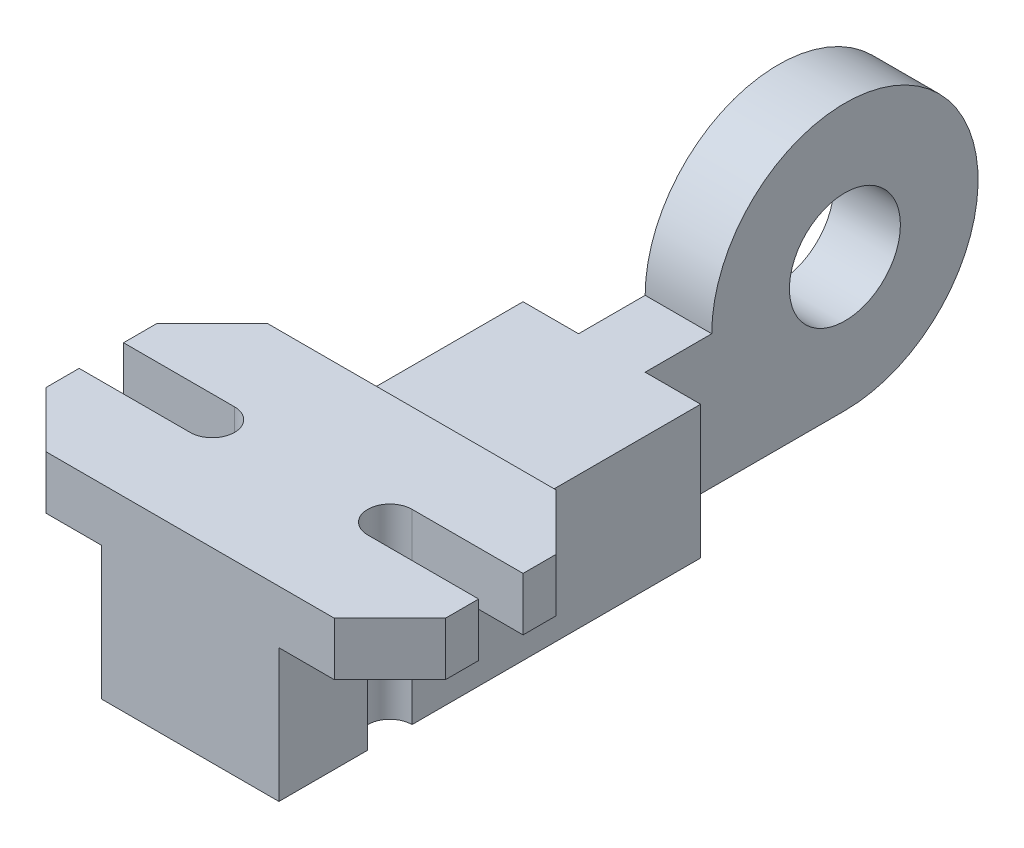
ISO-10303-21;
HEADER;
FILE_DESCRIPTION(('STEP AP214'),'2;1');
FILE_NAME('part.step','',(''),(''),'','','');
FILE_SCHEMA(('AUTOMOTIVE_DESIGN { 1 0 10303 214 1 1 1 1 }'));
ENDSEC;
DATA;
#1=APPLICATION_CONTEXT('core data for automotive mechanical design processes');
#2=APPLICATION_PROTOCOL_DEFINITION('international standard','automotive_design',2000,#1);
#3=PRODUCT_CONTEXT('',#1,'mechanical');
#4=PRODUCT('Part','Part','',(#3));
#5=PRODUCT_RELATED_PRODUCT_CATEGORY('part','',(#4));
#6=PRODUCT_DEFINITION_FORMATION('','',#4);
#7=PRODUCT_DEFINITION_CONTEXT('part definition',#1,'design');
#8=PRODUCT_DEFINITION('design','',#6,#7);
#9=PRODUCT_DEFINITION_SHAPE('','',#8);
#10=(LENGTH_UNIT() NAMED_UNIT(*) SI_UNIT(.MILLI.,.METRE.));
#11=(NAMED_UNIT(*) PLANE_ANGLE_UNIT() SI_UNIT($,.RADIAN.));
#12=(NAMED_UNIT(*) SI_UNIT($,.STERADIAN.) SOLID_ANGLE_UNIT());
#13=UNCERTAINTY_MEASURE_WITH_UNIT(LENGTH_MEASURE(1.E-05),#10,'distance_accuracy_value','');
#14=(GEOMETRIC_REPRESENTATION_CONTEXT(3) GLOBAL_UNCERTAINTY_ASSIGNED_CONTEXT((#13)) GLOBAL_UNIT_ASSIGNED_CONTEXT((#10,
#11,#12)) REPRESENTATION_CONTEXT('',''));
#15=CARTESIAN_POINT('',(0.,0.,0.));
#16=DIRECTION('',(0.,0.,1.));
#17=DIRECTION('',(1.,0.,0.));
#18=AXIS2_PLACEMENT_3D('',#15,#16,#17);
#19=CARTESIAN_POINT('',(-20.,0.,-48.7731958762886));
#20=DIRECTION('',(0.,0.,-1.));
#21=DIRECTION('',(-1.,0.,0.));
#22=AXIS2_PLACEMENT_3D('',#19,#20,#21);
#23=PLANE('',#22);
#24=DIRECTION('',(1.,0.,0.));
#25=VECTOR('',#24,1.);
#26=CARTESIAN_POINT('',(-20.,30.,-48.7731958762886));
#27=LINE('',#26,#25);
#28=CARTESIAN_POINT('',(-20.,30.,-48.7731958762886));
#29=VERTEX_POINT('',#28);
#30=CARTESIAN_POINT('',(-7.5,30.,-48.7731958762886));
#31=VERTEX_POINT('',#30);
#32=EDGE_CURVE('E11',#29,#31,#27,.T.);
#33=ORIENTED_EDGE('',*,*,#32,.T.);
#34=DIRECTION('',(0.,-1.,0.));
#35=VECTOR('',#34,1.);
#36=CARTESIAN_POINT('',(-7.5,0.,-48.7731958762886));
#37=LINE('',#36,#35);
#38=CARTESIAN_POINT('',(-7.5,0.,-48.7731958762886));
#39=VERTEX_POINT('',#38);
#40=EDGE_CURVE('E553',#31,#39,#37,.T.);
#41=ORIENTED_EDGE('',*,*,#40,.T.);
#42=DIRECTION('',(1.,0.,0.));
#43=VECTOR('',#42,1.);
#44=CARTESIAN_POINT('',(-20.,0.,-48.7731958762886));
#45=LINE('',#44,#43);
#46=CARTESIAN_POINT('',(-20.,0.,-48.7731958762886));
#47=VERTEX_POINT('',#46);
#48=EDGE_CURVE('E435',#47,#39,#45,.T.);
#49=ORIENTED_EDGE('',*,*,#48,.F.);
#50=DIRECTION('',(0.,1.,0.));
#51=VECTOR('',#50,1.);
#52=CARTESIAN_POINT('',(-20.,0.,-48.7731958762886));
#53=LINE('',#52,#51);
#54=EDGE_CURVE('E408',#47,#29,#53,.T.);
#55=ORIENTED_EDGE('',*,*,#54,.T.);
#56=EDGE_LOOP('',(#33,#41,#49,#55));
#57=FACE_BOUND('',#56,.T.);
#58=ADVANCED_FACE('F39',(#57),#23,.T.);
#59=CARTESIAN_POINT('',(-20.,0.,0.));
#60=DIRECTION('',(1.,0.,0.));
#61=DIRECTION('',(0.,0.,-1.));
#62=AXIS2_PLACEMENT_3D('',#59,#60,#61);
#63=PLANE('',#62);
#64=DIRECTION('',(0.,0.,-1.));
#65=VECTOR('',#64,1.);
#66=CARTESIAN_POINT('',(-20.,0.,46.2268041237114));
#67=LINE('',#66,#65);
#68=CARTESIAN_POINT('',(-20.,0.,16.2268041237114));
#69=VERTEX_POINT('',#68);
#70=EDGE_CURVE('E412',#69,#47,#67,.T.);
#71=ORIENTED_EDGE('',*,*,#70,.F.);
#72=DIRECTION('',(0.,1.,0.));
#73=VECTOR('',#72,1.);
#74=CARTESIAN_POINT('',(-20.,0.,16.2268041237114));
#75=LINE('',#74,#73);
#76=CARTESIAN_POINT('',(-20.,30.,16.2268041237114));
#77=VERTEX_POINT('',#76);
#78=EDGE_CURVE('E265',#69,#77,#75,.T.);
#79=ORIENTED_EDGE('',*,*,#78,.T.);
#80=DIRECTION('',(0.,0.,-1.));
#81=VECTOR('',#80,1.);
#82=CARTESIAN_POINT('',(-20.,30.,46.2268041237114));
#83=LINE('',#82,#81);
#84=CARTESIAN_POINT('',(-20.,30.,-3.74148784107145));
#85=VERTEX_POINT('',#84);
#86=EDGE_CURVE('E409',#77,#85,#83,.T.);
#87=ORIENTED_EDGE('',*,*,#86,.T.);
#88=EDGE_CURVE('E410',#85,#29,#83,.T.);
#89=ORIENTED_EDGE('',*,*,#88,.T.);
#90=ORIENTED_EDGE('',*,*,#54,.F.);
#91=EDGE_LOOP('',(#71,#79,#87,#89,#90));
#92=FACE_BOUND('',#91,.T.);
#93=ADVANCED_FACE('F546',(#92),#63,.F.);
#94=CARTESIAN_POINT('',(20.,0.,0.));
#95=DIRECTION('',(1.,0.,0.));
#96=DIRECTION('',(0.,0.,-1.));
#97=AXIS2_PLACEMENT_3D('',#94,#95,#96);
#98=PLANE('',#97);
#99=DIRECTION('',(0.,1.,0.));
#100=VECTOR('',#99,1.);
#101=CARTESIAN_POINT('',(20.,0.,16.2268041237114));
#102=LINE('',#101,#100);
#103=CARTESIAN_POINT('',(20.,0.,16.2268041237114));
#104=VERTEX_POINT('',#103);
#105=CARTESIAN_POINT('',(20.,30.,16.2268041237114));
#106=VERTEX_POINT('',#105);
#107=EDGE_CURVE('E259',#104,#106,#102,.T.);
#108=ORIENTED_EDGE('',*,*,#107,.F.);
#109=DIRECTION('',(0.,0.,-1.));
#110=VECTOR('',#109,1.);
#111=CARTESIAN_POINT('',(20.,0.,46.2268041237114));
#112=LINE('',#111,#110);
#113=CARTESIAN_POINT('',(20.,0.,-48.7731958762886));
#114=VERTEX_POINT('',#113);
#115=EDGE_CURVE('E427',#104,#114,#112,.T.);
#116=ORIENTED_EDGE('',*,*,#115,.T.);
#117=DIRECTION('',(0.,1.,0.));
#118=VECTOR('',#117,1.);
#119=CARTESIAN_POINT('',(20.,0.,-48.7731958762886));
#120=LINE('',#119,#118);
#121=CARTESIAN_POINT('',(20.,30.,-48.7731958762886));
#122=VERTEX_POINT('',#121);
#123=EDGE_CURVE('E423',#114,#122,#120,.T.);
#124=ORIENTED_EDGE('',*,*,#123,.T.);
#125=DIRECTION('',(0.,0.,-1.));
#126=VECTOR('',#125,1.);
#127=CARTESIAN_POINT('',(20.,30.,46.2268041237114));
#128=LINE('',#127,#126);
#129=CARTESIAN_POINT('',(20.,30.,-3.77319587628865));
#130=VERTEX_POINT('',#129);
#131=EDGE_CURVE('E404',#130,#122,#128,.T.);
#132=ORIENTED_EDGE('',*,*,#131,.F.);
#133=EDGE_CURVE('E424',#106,#130,#128,.T.);
#134=ORIENTED_EDGE('',*,*,#133,.F.);
#135=EDGE_LOOP('',(#108,#116,#124,#132,#134));
#136=FACE_BOUND('',#135,.T.);
#137=ADVANCED_FACE('F442',(#136),#98,.T.);
#138=CARTESIAN_POINT('',(-20.,30.,46.2268041237114));
#139=DIRECTION('',(0.,-1.,0.));
#140=DIRECTION('',(0.,0.,-1.));
#141=AXIS2_PLACEMENT_3D('',#138,#139,#140);
#142=PLANE('',#141);
#143=ORIENTED_EDGE('',*,*,#88,.F.);
#144=DIRECTION('',(0.999999685812805,0.,-0.000792700631373391));
#145=VECTOR('',#144,1.);
#146=CARTESIAN_POINT('',(19.9970089861863,30.,-3.77319350530936));
#147=LINE('',#146,#145);
#148=EDGE_CURVE('E345',#85,#130,#147,.T.);
#149=ORIENTED_EDGE('',*,*,#148,.T.);
#150=ORIENTED_EDGE('',*,*,#131,.T.);
#151=CARTESIAN_POINT('',(7.5,30.,-48.7731958762886));
#152=VERTEX_POINT('',#151);
#153=EDGE_CURVE('E47',#152,#122,#27,.T.);
#154=ORIENTED_EDGE('',*,*,#153,.F.);
#155=DIRECTION('',(0.,0.,-1.));
#156=VECTOR('',#155,1.);
#157=CARTESIAN_POINT('',(7.5,30.,0.));
#158=LINE('',#157,#156);
#159=CARTESIAN_POINT('',(7.5,30.,-63.7731958762887));
#160=VERTEX_POINT('',#159);
#161=EDGE_CURVE('E234',#152,#160,#158,.T.);
#162=ORIENTED_EDGE('',*,*,#161,.T.);
#163=DIRECTION('',(-1.,0.,0.));
#164=VECTOR('',#163,1.);
#165=CARTESIAN_POINT('',(7.5,30.,-63.7731958762887));
#166=LINE('',#165,#164);
#167=CARTESIAN_POINT('',(-7.5,30.,-63.7731958762887));
#168=VERTEX_POINT('',#167);
#169=EDGE_CURVE('E230',#160,#168,#166,.T.);
#170=ORIENTED_EDGE('',*,*,#169,.T.);
#171=DIRECTION('',(0.,0.,-1.));
#172=VECTOR('',#171,1.);
#173=CARTESIAN_POINT('',(-7.5,30.,0.));
#174=LINE('',#173,#172);
#175=EDGE_CURVE('E552',#31,#168,#174,.T.);
#176=ORIENTED_EDGE('',*,*,#175,.F.);
#177=ORIENTED_EDGE('',*,*,#32,.F.);
#178=EDGE_LOOP('',(#143,#149,#150,#154,#162,#170,#176,#177));
#179=FACE_BOUND('',#178,.T.);
#180=ADVANCED_FACE('F41',(#179),#142,.F.);
#181=DIRECTION('',(0.,-1.,0.));
#182=VECTOR('',#181,1.);
#183=CARTESIAN_POINT('',(7.5,0.,-48.7731958762886));
#184=LINE('',#183,#182);
#185=CARTESIAN_POINT('',(7.5,0.,-48.7731958762886));
#186=VERTEX_POINT('',#185);
#187=EDGE_CURVE('E54',#152,#186,#184,.T.);
#188=ORIENTED_EDGE('',*,*,#187,.F.);
#189=ORIENTED_EDGE('',*,*,#153,.T.);
#190=ORIENTED_EDGE('',*,*,#123,.F.);
#191=EDGE_CURVE('E434',#186,#114,#45,.T.);
#192=ORIENTED_EDGE('',*,*,#191,.F.);
#193=EDGE_LOOP('',(#188,#189,#190,#192));
#194=FACE_BOUND('',#193,.T.);
#195=ADVANCED_FACE('F445',(#194),#23,.T.);
#196=CARTESIAN_POINT('',(-20.,0.,46.2268041237114));
#197=DIRECTION('',(0.,-1.,0.));
#198=DIRECTION('',(0.,0.,-1.));
#199=AXIS2_PLACEMENT_3D('',#196,#197,#198);
#200=PLANE('',#199);
#201=CARTESIAN_POINT('',(-20.,0.,21.2268041237114));
#202=DIRECTION('',(0.,1.,0.));
#203=DIRECTION('',(0.,0.,1.));
#204=AXIS2_PLACEMENT_3D('',#201,#202,#203);
#205=CIRCLE('',#204,5.);
#206=CARTESIAN_POINT('',(-20.,0.,26.2268041237114));
#207=VERTEX_POINT('',#206);
#208=EDGE_CURVE('E257',#207,#69,#205,.T.);
#209=ORIENTED_EDGE('',*,*,#208,.T.);
#210=ORIENTED_EDGE('',*,*,#70,.T.);
#211=ORIENTED_EDGE('',*,*,#48,.T.);
#212=DIRECTION('',(0.,0.,-1.));
#213=VECTOR('',#212,1.);
#214=CARTESIAN_POINT('',(-7.5,0.,0.));
#215=LINE('',#214,#213);
#216=CARTESIAN_POINT('',(-7.5,0.,-93.7731958762887));
#217=VERTEX_POINT('',#216);
#218=EDGE_CURVE('E247',#39,#217,#215,.T.);
#219=ORIENTED_EDGE('',*,*,#218,.T.);
#220=DIRECTION('',(-1.,0.,0.));
#221=VECTOR('',#220,1.);
#222=CARTESIAN_POINT('',(7.5,0.,-93.7731958762887));
#223=LINE('',#222,#221);
#224=CARTESIAN_POINT('',(7.5,0.,-93.7731958762887));
#225=VERTEX_POINT('',#224);
#226=EDGE_CURVE('E228',#225,#217,#223,.T.);
#227=ORIENTED_EDGE('',*,*,#226,.F.);
#228=DIRECTION('',(0.,0.,-1.));
#229=VECTOR('',#228,1.);
#230=CARTESIAN_POINT('',(7.5,0.,0.));
#231=LINE('',#230,#229);
#232=EDGE_CURVE('E235',#186,#225,#231,.T.);
#233=ORIENTED_EDGE('',*,*,#232,.F.);
#234=ORIENTED_EDGE('',*,*,#191,.T.);
#235=ORIENTED_EDGE('',*,*,#115,.F.);
#236=CARTESIAN_POINT('',(20.,0.,21.2268041237114));
#237=DIRECTION('',(0.,1.,0.));
#238=DIRECTION('',(0.,0.,1.));
#239=AXIS2_PLACEMENT_3D('',#236,#237,#238);
#240=CIRCLE('',#239,5.);
#241=CARTESIAN_POINT('',(20.,0.,26.2268041237114));
#242=VERTEX_POINT('',#241);
#243=EDGE_CURVE('E248',#104,#242,#240,.T.);
#244=ORIENTED_EDGE('',*,*,#243,.T.);
#245=CARTESIAN_POINT('',(20.,0.,46.2268041237114));
#246=VERTEX_POINT('',#245);
#247=EDGE_CURVE('E428',#246,#242,#112,.T.);
#248=ORIENTED_EDGE('',*,*,#247,.F.);
#249=DIRECTION('',(1.,0.,0.));
#250=VECTOR('',#249,1.);
#251=CARTESIAN_POINT('',(-20.,0.,46.2268041237114));
#252=LINE('',#251,#250);
#253=CARTESIAN_POINT('',(-20.,0.,46.2268041237114));
#254=VERTEX_POINT('',#253);
#255=EDGE_CURVE('E419',#254,#246,#252,.T.);
#256=ORIENTED_EDGE('',*,*,#255,.F.);
#257=EDGE_CURVE('E413',#254,#207,#67,.T.);
#258=ORIENTED_EDGE('',*,*,#257,.T.);
#259=EDGE_LOOP('',(#209,#210,#211,#219,#227,#233,#234,#235,#244,#248,#256,#258));
#260=FACE_BOUND('',#259,.T.);
#261=ADVANCED_FACE('F244',(#260),#200,.T.);
#262=CARTESIAN_POINT('',(-20.,0.,46.2268041237114));
#263=DIRECTION('',(0.,0.,-1.));
#264=DIRECTION('',(-1.,0.,0.));
#265=AXIS2_PLACEMENT_3D('',#262,#263,#264);
#266=PLANE('',#265);
#267=DIRECTION('',(0.,1.,0.));
#268=VECTOR('',#267,1.);
#269=CARTESIAN_POINT('',(20.,0.,46.2268041237114));
#270=LINE('',#269,#268);
#271=CARTESIAN_POINT('',(20.,30.,46.2268041237114));
#272=VERTEX_POINT('',#271);
#273=EDGE_CURVE('E431',#246,#272,#270,.T.);
#274=ORIENTED_EDGE('',*,*,#273,.T.);
#275=DIRECTION('',(1.,0.,0.));
#276=VECTOR('',#275,1.);
#277=CARTESIAN_POINT('',(20.,30.,46.2268041237114));
#278=LINE('',#277,#276);
#279=CARTESIAN_POINT('',(32.4682919647828,30.,46.2268041237114));
#280=VERTEX_POINT('',#279);
#281=EDGE_CURVE('E324',#272,#280,#278,.T.);
#282=ORIENTED_EDGE('',*,*,#281,.T.);
#283=DIRECTION('',(0.,-1.,0.));
#284=VECTOR('',#283,1.);
#285=CARTESIAN_POINT('',(32.4682919647828,42.,46.2268041237114));
#286=LINE('',#285,#284);
#287=CARTESIAN_POINT('',(32.4682919647828,42.,46.2268041237114));
#288=VERTEX_POINT('',#287);
#289=EDGE_CURVE('E392',#288,#280,#286,.T.);
#290=ORIENTED_EDGE('',*,*,#289,.F.);
#291=DIRECTION('',(1.,0.,0.));
#292=VECTOR('',#291,1.);
#293=CARTESIAN_POINT('',(20.,42.,46.2268041237114));
#294=LINE('',#293,#292);
#295=CARTESIAN_POINT('',(-32.4682919647828,42.,46.2268041237114));
#296=VERTEX_POINT('',#295);
#297=EDGE_CURVE('E280',#296,#288,#294,.T.);
#298=ORIENTED_EDGE('',*,*,#297,.F.);
#299=DIRECTION('',(0.,-1.,0.));
#300=VECTOR('',#299,1.);
#301=CARTESIAN_POINT('',(-32.4682919647828,42.,46.2268041237114));
#302=LINE('',#301,#300);
#303=CARTESIAN_POINT('',(-32.4682919647828,30.,46.2268041237114));
#304=VERTEX_POINT('',#303);
#305=EDGE_CURVE('E395',#296,#304,#302,.T.);
#306=ORIENTED_EDGE('',*,*,#305,.T.);
#307=CARTESIAN_POINT('',(-20.,30.,46.2268041237114));
#308=VERTEX_POINT('',#307);
#309=EDGE_CURVE('E325',#304,#308,#278,.T.);
#310=ORIENTED_EDGE('',*,*,#309,.T.);
#311=DIRECTION('',(0.,1.,0.));
#312=VECTOR('',#311,1.);
#313=CARTESIAN_POINT('',(-20.,0.,46.2268041237114));
#314=LINE('',#313,#312);
#315=EDGE_CURVE('E416',#254,#308,#314,.T.);
#316=ORIENTED_EDGE('',*,*,#315,.F.);
#317=ORIENTED_EDGE('',*,*,#255,.T.);
#318=EDGE_LOOP('',(#274,#282,#290,#298,#306,#310,#316,#317));
#319=FACE_BOUND('',#318,.T.);
#320=ADVANCED_FACE('F485',(#319),#266,.F.);
#321=CARTESIAN_POINT('',(-20.,30.,26.2268041237114));
#322=VERTEX_POINT('',#321);
#323=EDGE_CURVE('E405',#308,#322,#83,.T.);
#324=ORIENTED_EDGE('',*,*,#323,.T.);
#325=DIRECTION('',(0.,1.,0.));
#326=VECTOR('',#325,1.);
#327=CARTESIAN_POINT('',(-20.,0.,26.2268041237114));
#328=LINE('',#327,#326);
#329=EDGE_CURVE('E258',#322,#207,#328,.F.);
#330=ORIENTED_EDGE('',*,*,#329,.T.);
#331=ORIENTED_EDGE('',*,*,#257,.F.);
#332=ORIENTED_EDGE('',*,*,#315,.T.);
#333=EDGE_LOOP('',(#324,#330,#331,#332));
#334=FACE_BOUND('',#333,.T.);
#335=ADVANCED_FACE('F491',(#334),#63,.F.);
#336=DIRECTION('',(0.,1.,0.));
#337=VECTOR('',#336,1.);
#338=CARTESIAN_POINT('',(20.,0.,26.2268041237114));
#339=LINE('',#338,#337);
#340=CARTESIAN_POINT('',(20.,30.,26.2268041237114));
#341=VERTEX_POINT('',#340);
#342=EDGE_CURVE('E251',#242,#341,#339,.T.);
#343=ORIENTED_EDGE('',*,*,#342,.T.);
#344=EDGE_CURVE('E420',#272,#341,#128,.T.);
#345=ORIENTED_EDGE('',*,*,#344,.F.);
#346=ORIENTED_EDGE('',*,*,#273,.F.);
#347=ORIENTED_EDGE('',*,*,#247,.T.);
#348=EDGE_LOOP('',(#343,#345,#346,#347));
#349=FACE_BOUND('',#348,.T.);
#350=ADVANCED_FACE('F481',(#349),#98,.T.);
#351=CARTESIAN_POINT('',(20.,30.,0.));
#352=DIRECTION('',(0.,1.,0.));
#353=DIRECTION('',(0.,0.,1.));
#354=AXIS2_PLACEMENT_3D('',#351,#352,#353);
#355=PLANE('',#354);
#356=ORIENTED_EDGE('',*,*,#281,.F.);
#357=ORIENTED_EDGE('',*,*,#344,.T.);
#358=DIRECTION('',(1.,0.,0.));
#359=VECTOR('',#358,1.);
#360=CARTESIAN_POINT('',(20.,30.,26.2268041237114));
#361=LINE('',#360,#359);
#362=CARTESIAN_POINT('',(45.,30.,26.2268041237114));
#363=VERTEX_POINT('',#362);
#364=EDGE_CURVE('E333',#341,#363,#361,.T.);
#365=ORIENTED_EDGE('',*,*,#364,.T.);
#366=DIRECTION('',(0.,0.,-1.));
#367=VECTOR('',#366,1.);
#368=CARTESIAN_POINT('',(45.,30.,0.));
#369=LINE('',#368,#367);
#370=CARTESIAN_POINT('',(45.,30.,33.6950960884941));
#371=VERTEX_POINT('',#370);
#372=EDGE_CURVE('E330',#371,#363,#369,.T.);
#373=ORIENTED_EDGE('',*,*,#372,.F.);
#374=DIRECTION('',(0.707106781186546,0.,-0.707106781186549));
#375=VECTOR('',#374,1.);
#376=CARTESIAN_POINT('',(49.3475480442471,30.,29.3475480442469));
#377=LINE('',#376,#375);
#378=EDGE_CURVE('E328',#280,#371,#377,.T.);
#379=ORIENTED_EDGE('',*,*,#378,.F.);
#380=EDGE_LOOP('',(#356,#357,#365,#373,#379));
#381=FACE_BOUND('',#380,.T.);
#382=ADVANCED_FACE('F600',(#381),#355,.F.);
#383=DIRECTION('',(1.,0.,0.));
#384=VECTOR('',#383,1.);
#385=CARTESIAN_POINT('',(20.,30.,16.2268041237114));
#386=LINE('',#385,#384);
#387=CARTESIAN_POINT('',(45.,30.,16.2268041237114));
#388=VERTEX_POINT('',#387);
#389=EDGE_CURVE('E336',#106,#388,#386,.T.);
#390=ORIENTED_EDGE('',*,*,#389,.F.);
#391=ORIENTED_EDGE('',*,*,#133,.T.);
#392=DIRECTION('',(-1.,0.,0.));
#393=VECTOR('',#392,1.);
#394=CARTESIAN_POINT('',(20.,30.,-3.77319587628864));
#395=LINE('',#394,#393);
#396=CARTESIAN_POINT('',(32.4682919647828,30.,-3.77319587628865));
#397=VERTEX_POINT('',#396);
#398=EDGE_CURVE('E342',#397,#130,#395,.T.);
#399=ORIENTED_EDGE('',*,*,#398,.F.);
#400=DIRECTION('',(-0.707106781186546,0.,-0.70710678118655));
#401=VECTOR('',#400,1.);
#402=CARTESIAN_POINT('',(28.1207439205358,30.,-8.12074392053571));
#403=LINE('',#402,#401);
#404=CARTESIAN_POINT('',(45.,30.,8.75851215892862));
#405=VERTEX_POINT('',#404);
#406=EDGE_CURVE('E340',#405,#397,#403,.T.);
#407=ORIENTED_EDGE('',*,*,#406,.F.);
#408=DIRECTION('',(0.,0.,-1.));
#409=VECTOR('',#408,1.);
#410=CARTESIAN_POINT('',(45.,30.,0.));
#411=LINE('',#410,#409);
#412=EDGE_CURVE('E338',#388,#405,#411,.T.);
#413=ORIENTED_EDGE('',*,*,#412,.F.);
#414=EDGE_LOOP('',(#390,#391,#399,#407,#413));
#415=FACE_BOUND('',#414,.T.);
#416=ADVANCED_FACE('F453',(#415),#355,.F.);
#417=ORIENTED_EDGE('',*,*,#323,.F.);
#418=ORIENTED_EDGE('',*,*,#309,.F.);
#419=DIRECTION('',(-0.707106781186548,0.,-0.707106781186547));
#420=VECTOR('',#419,1.);
#421=CARTESIAN_POINT('',(-29.3475480442471,30.,49.3475480442471));
#422=LINE('',#421,#420);
#423=CARTESIAN_POINT('',(-45.,30.,33.6950960884941));
#424=VERTEX_POINT('',#423);
#425=EDGE_CURVE('E321',#304,#424,#422,.T.);
#426=ORIENTED_EDGE('',*,*,#425,.T.);
#427=DIRECTION('',(0.,0.,-1.));
#428=VECTOR('',#427,1.);
#429=CARTESIAN_POINT('',(-45.,30.,0.));
#430=LINE('',#429,#428);
#431=CARTESIAN_POINT('',(-45.,30.,26.2268041237114));
#432=VERTEX_POINT('',#431);
#433=EDGE_CURVE('E318',#424,#432,#430,.T.);
#434=ORIENTED_EDGE('',*,*,#433,.T.);
#435=DIRECTION('',(-1.,0.,0.));
#436=VECTOR('',#435,1.);
#437=CARTESIAN_POINT('',(20.,30.,26.2268041237113));
#438=LINE('',#437,#436);
#439=EDGE_CURVE('E267',#322,#432,#438,.T.);
#440=ORIENTED_EDGE('',*,*,#439,.F.);
#441=EDGE_LOOP('',(#417,#418,#426,#434,#440));
#442=FACE_BOUND('',#441,.T.);
#443=ADVANCED_FACE('F501',(#442),#355,.F.);
#444=CARTESIAN_POINT('',(-20.,42.,21.2268041237114));
#445=DIRECTION('',(0.,-1.,0.));
#446=DIRECTION('',(0.,0.,-1.));
#447=AXIS2_PLACEMENT_3D('',#444,#445,#446);
#448=CYLINDRICAL_SURFACE('',#447,4.99999999999999);
#449=DIRECTION('',(0.,-1.,0.));
#450=VECTOR('',#449,1.);
#451=CARTESIAN_POINT('',(-20.,42.,16.2268041237114));
#452=LINE('',#451,#450);
#453=CARTESIAN_POINT('',(-20.,42.,16.2268041237114));
#454=VERTEX_POINT('',#453);
#455=EDGE_CURVE('E315',#454,#77,#452,.T.);
#456=ORIENTED_EDGE('',*,*,#455,.T.);
#457=ORIENTED_EDGE('',*,*,#78,.F.);
#458=ORIENTED_EDGE('',*,*,#208,.F.);
#459=ORIENTED_EDGE('',*,*,#329,.F.);
#460=DIRECTION('',(0.,-1.,0.));
#461=VECTOR('',#460,1.);
#462=CARTESIAN_POINT('',(-20.,42.,26.2268041237114));
#463=LINE('',#462,#461);
#464=CARTESIAN_POINT('',(-20.,42.,26.2268041237114));
#465=VERTEX_POINT('',#464);
#466=EDGE_CURVE('E401',#465,#322,#463,.T.);
#467=ORIENTED_EDGE('',*,*,#466,.F.);
#468=CARTESIAN_POINT('',(-20.,42.,21.2268041237114));
#469=DIRECTION('',(0.,1.,0.));
#470=DIRECTION('',(0.,0.,1.));
#471=AXIS2_PLACEMENT_3D('',#468,#469,#470);
#472=CIRCLE('',#471,4.99999999999999);
#473=EDGE_CURVE('E268',#465,#454,#472,.T.);
#474=ORIENTED_EDGE('',*,*,#473,.T.);
#475=EDGE_LOOP('',(#456,#457,#458,#459,#467,#474));
#476=FACE_BOUND('',#475,.T.);
#477=ADVANCED_FACE('F493',(#476),#448,.F.);
#478=CARTESIAN_POINT('',(20.,42.,26.2268041237113));
#479=DIRECTION('',(0.,0.,1.));
#480=DIRECTION('',(1.,0.,0.));
#481=AXIS2_PLACEMENT_3D('',#478,#479,#480);
#482=PLANE('',#481);
#483=ORIENTED_EDGE('',*,*,#439,.T.);
#484=DIRECTION('',(0.,-1.,0.));
#485=VECTOR('',#484,1.);
#486=CARTESIAN_POINT('',(-45.,42.,26.2268041237114));
#487=LINE('',#486,#485);
#488=CARTESIAN_POINT('',(-45.,42.,26.2268041237114));
#489=VERTEX_POINT('',#488);
#490=EDGE_CURVE('E399',#489,#432,#487,.T.);
#491=ORIENTED_EDGE('',*,*,#490,.F.);
#492=DIRECTION('',(-1.,0.,0.));
#493=VECTOR('',#492,1.);
#494=CARTESIAN_POINT('',(20.,42.,26.2268041237113));
#495=LINE('',#494,#493);
#496=EDGE_CURVE('E271',#465,#489,#495,.T.);
#497=ORIENTED_EDGE('',*,*,#496,.F.);
#498=ORIENTED_EDGE('',*,*,#466,.T.);
#499=EDGE_LOOP('',(#483,#491,#497,#498));
#500=FACE_BOUND('',#499,.T.);
#501=ADVANCED_FACE('F497',(#500),#482,.F.);
#502=CARTESIAN_POINT('',(-45.,42.,0.));
#503=DIRECTION('',(-1.,0.,0.));
#504=DIRECTION('',(0.,0.,1.));
#505=AXIS2_PLACEMENT_3D('',#502,#503,#504);
#506=PLANE('',#505);
#507=ORIENTED_EDGE('',*,*,#433,.F.);
#508=DIRECTION('',(0.,-1.,0.));
#509=VECTOR('',#508,1.);
#510=CARTESIAN_POINT('',(-45.,42.,33.6950960884941));
#511=LINE('',#510,#509);
#512=CARTESIAN_POINT('',(-45.,42.,33.6950960884941));
#513=VERTEX_POINT('',#512);
#514=EDGE_CURVE('E397',#513,#424,#511,.T.);
#515=ORIENTED_EDGE('',*,*,#514,.F.);
#516=DIRECTION('',(0.,0.,-1.));
#517=VECTOR('',#516,1.);
#518=CARTESIAN_POINT('',(-45.,42.,0.));
#519=LINE('',#518,#517);
#520=EDGE_CURVE('E274',#513,#489,#519,.T.);
#521=ORIENTED_EDGE('',*,*,#520,.T.);
#522=ORIENTED_EDGE('',*,*,#490,.T.);
#523=EDGE_LOOP('',(#507,#515,#521,#522));
#524=FACE_BOUND('',#523,.T.);
#525=ADVANCED_FACE('F506',(#524),#506,.T.);
#526=CARTESIAN_POINT('',(-29.3475480442471,42.,49.3475480442471));
#527=DIRECTION('',(-0.707106781186547,0.,0.707106781186548));
#528=DIRECTION('',(0.707106781186548,0.,0.707106781186547));
#529=AXIS2_PLACEMENT_3D('',#526,#527,#528);
#530=PLANE('',#529);
#531=ORIENTED_EDGE('',*,*,#425,.F.);
#532=ORIENTED_EDGE('',*,*,#305,.F.);
#533=DIRECTION('',(-0.707106781186548,0.,-0.707106781186547));
#534=VECTOR('',#533,1.);
#535=CARTESIAN_POINT('',(-29.3475480442471,42.,49.3475480442471));
#536=LINE('',#535,#534);
#537=EDGE_CURVE('E277',#296,#513,#536,.T.);
#538=ORIENTED_EDGE('',*,*,#537,.T.);
#539=ORIENTED_EDGE('',*,*,#514,.T.);
#540=EDGE_LOOP('',(#531,#532,#538,#539));
#541=FACE_BOUND('',#540,.T.);
#542=ADVANCED_FACE('F512',(#541),#530,.T.);
#543=CARTESIAN_POINT('',(49.3475480442471,42.,29.3475480442469));
#544=DIRECTION('',(-0.707106781186549,0.,-0.707106781186546));
#545=DIRECTION('',(-0.707106781186546,0.,0.707106781186549));
#546=AXIS2_PLACEMENT_3D('',#543,#544,#545);
#547=PLANE('',#546);
#548=ORIENTED_EDGE('',*,*,#378,.T.);
#549=DIRECTION('',(0.,-1.,0.));
#550=VECTOR('',#549,1.);
#551=CARTESIAN_POINT('',(45.,42.,33.6950960884941));
#552=LINE('',#551,#550);
#553=CARTESIAN_POINT('',(45.,42.,33.6950960884941));
#554=VERTEX_POINT('',#553);
#555=EDGE_CURVE('E389',#554,#371,#552,.T.);
#556=ORIENTED_EDGE('',*,*,#555,.F.);
#557=DIRECTION('',(0.707106781186546,0.,-0.707106781186549));
#558=VECTOR('',#557,1.);
#559=CARTESIAN_POINT('',(49.3475480442471,42.,29.3475480442469));
#560=LINE('',#559,#558);
#561=EDGE_CURVE('E282',#288,#554,#560,.T.);
#562=ORIENTED_EDGE('',*,*,#561,.F.);
#563=ORIENTED_EDGE('',*,*,#289,.T.);
#564=EDGE_LOOP('',(#548,#556,#562,#563));
#565=FACE_BOUND('',#564,.T.);
#566=ADVANCED_FACE('F520',(#565),#547,.F.);
#567=CARTESIAN_POINT('',(45.,42.,0.));
#568=DIRECTION('',(-1.,0.,0.));
#569=DIRECTION('',(0.,0.,1.));
#570=AXIS2_PLACEMENT_3D('',#567,#568,#569);
#571=PLANE('',#570);
#572=ORIENTED_EDGE('',*,*,#372,.T.);
#573=DIRECTION('',(0.,-1.,0.));
#574=VECTOR('',#573,1.);
#575=CARTESIAN_POINT('',(45.,42.,26.2268041237114));
#576=LINE('',#575,#574);
#577=CARTESIAN_POINT('',(45.,42.,26.2268041237114));
#578=VERTEX_POINT('',#577);
#579=EDGE_CURVE('E387',#578,#363,#576,.T.);
#580=ORIENTED_EDGE('',*,*,#579,.F.);
#581=DIRECTION('',(0.,0.,-1.));
#582=VECTOR('',#581,1.);
#583=CARTESIAN_POINT('',(45.,42.,0.));
#584=LINE('',#583,#582);
#585=EDGE_CURVE('E284',#554,#578,#584,.T.);
#586=ORIENTED_EDGE('',*,*,#585,.F.);
#587=ORIENTED_EDGE('',*,*,#555,.T.);
#588=EDGE_LOOP('',(#572,#580,#586,#587));
#589=FACE_BOUND('',#588,.T.);
#590=ADVANCED_FACE('F524',(#589),#571,.F.);
#591=CARTESIAN_POINT('',(20.,42.,26.2268041237114));
#592=DIRECTION('',(0.,0.,-1.));
#593=DIRECTION('',(-1.,0.,0.));
#594=AXIS2_PLACEMENT_3D('',#591,#592,#593);
#595=PLANE('',#594);
#596=ORIENTED_EDGE('',*,*,#364,.F.);
#597=DIRECTION('',(0.,-1.,0.));
#598=VECTOR('',#597,1.);
#599=CARTESIAN_POINT('',(20.,42.,26.2268041237114));
#600=LINE('',#599,#598);
#601=CARTESIAN_POINT('',(20.,42.,26.2268041237114));
#602=VERTEX_POINT('',#601);
#603=EDGE_CURVE('E384',#602,#341,#600,.T.);
#604=ORIENTED_EDGE('',*,*,#603,.F.);
#605=DIRECTION('',(1.,0.,0.));
#606=VECTOR('',#605,1.);
#607=CARTESIAN_POINT('',(20.,42.,26.2268041237114));
#608=LINE('',#607,#606);
#609=EDGE_CURVE('E286',#602,#578,#608,.T.);
#610=ORIENTED_EDGE('',*,*,#609,.T.);
#611=ORIENTED_EDGE('',*,*,#579,.T.);
#612=EDGE_LOOP('',(#596,#604,#610,#611));
#613=FACE_BOUND('',#612,.T.);
#614=ADVANCED_FACE('F526',(#613),#595,.T.);
#615=CARTESIAN_POINT('',(20.,42.,21.2268041237114));
#616=DIRECTION('',(0.,-1.,0.));
#617=DIRECTION('',(0.,0.,-1.));
#618=AXIS2_PLACEMENT_3D('',#615,#616,#617);
#619=CYLINDRICAL_SURFACE('',#618,5.);
#620=ORIENTED_EDGE('',*,*,#603,.T.);
#621=ORIENTED_EDGE('',*,*,#342,.F.);
#622=ORIENTED_EDGE('',*,*,#243,.F.);
#623=ORIENTED_EDGE('',*,*,#107,.T.);
#624=DIRECTION('',(0.,-1.,0.));
#625=VECTOR('',#624,1.);
#626=CARTESIAN_POINT('',(20.,42.,16.2268041237114));
#627=LINE('',#626,#625);
#628=CARTESIAN_POINT('',(20.,42.,16.2268041237114));
#629=VERTEX_POINT('',#628);
#630=EDGE_CURVE('E381',#629,#106,#627,.T.);
#631=ORIENTED_EDGE('',*,*,#630,.F.);
#632=CARTESIAN_POINT('',(20.,42.,21.2268041237114));
#633=DIRECTION('',(0.,1.,0.));
#634=DIRECTION('',(0.,0.,1.));
#635=AXIS2_PLACEMENT_3D('',#632,#633,#634);
#636=CIRCLE('',#635,5.);
#637=EDGE_CURVE('E289',#629,#602,#636,.T.);
#638=ORIENTED_EDGE('',*,*,#637,.T.);
#639=EDGE_LOOP('',(#620,#621,#622,#623,#631,#638));
#640=FACE_BOUND('',#639,.T.);
#641=ADVANCED_FACE('F477',(#640),#619,.F.);
#642=CARTESIAN_POINT('',(20.,42.,16.2268041237114));
#643=DIRECTION('',(0.,0.,-1.));
#644=DIRECTION('',(-1.,0.,0.));
#645=AXIS2_PLACEMENT_3D('',#642,#643,#644);
#646=PLANE('',#645);
#647=ORIENTED_EDGE('',*,*,#389,.T.);
#648=DIRECTION('',(0.,-1.,0.));
#649=VECTOR('',#648,1.);
#650=CARTESIAN_POINT('',(45.,42.,16.2268041237114));
#651=LINE('',#650,#649);
#652=CARTESIAN_POINT('',(45.,42.,16.2268041237114));
#653=VERTEX_POINT('',#652);
#654=EDGE_CURVE('E378',#653,#388,#651,.T.);
#655=ORIENTED_EDGE('',*,*,#654,.F.);
#656=DIRECTION('',(1.,0.,0.));
#657=VECTOR('',#656,1.);
#658=CARTESIAN_POINT('',(20.,42.,16.2268041237114));
#659=LINE('',#658,#657);
#660=EDGE_CURVE('E292',#629,#653,#659,.T.);
#661=ORIENTED_EDGE('',*,*,#660,.F.);
#662=ORIENTED_EDGE('',*,*,#630,.T.);
#663=EDGE_LOOP('',(#647,#655,#661,#662));
#664=FACE_BOUND('',#663,.T.);
#665=ADVANCED_FACE('F474',(#664),#646,.F.);
#666=CARTESIAN_POINT('',(45.,42.,0.));
#667=DIRECTION('',(-1.,0.,0.));
#668=DIRECTION('',(0.,0.,1.));
#669=AXIS2_PLACEMENT_3D('',#666,#667,#668);
#670=PLANE('',#669);
#671=ORIENTED_EDGE('',*,*,#412,.T.);
#672=DIRECTION('',(0.,-1.,0.));
#673=VECTOR('',#672,1.);
#674=CARTESIAN_POINT('',(45.,42.,8.75851215892862));
#675=LINE('',#674,#673);
#676=CARTESIAN_POINT('',(45.,42.,8.75851215892862));
#677=VERTEX_POINT('',#676);
#678=EDGE_CURVE('E375',#677,#405,#675,.T.);
#679=ORIENTED_EDGE('',*,*,#678,.F.);
#680=DIRECTION('',(0.,0.,-1.));
#681=VECTOR('',#680,1.);
#682=CARTESIAN_POINT('',(45.,42.,0.));
#683=LINE('',#682,#681);
#684=EDGE_CURVE('E294',#653,#677,#683,.T.);
#685=ORIENTED_EDGE('',*,*,#684,.F.);
#686=ORIENTED_EDGE('',*,*,#654,.T.);
#687=EDGE_LOOP('',(#671,#679,#685,#686));
#688=FACE_BOUND('',#687,.T.);
#689=ADVANCED_FACE('F469',(#688),#670,.F.);
#690=CARTESIAN_POINT('',(28.1207439205358,42.,-8.12074392053571));
#691=DIRECTION('',(-0.707106781186549,0.,0.707106781186545));
#692=DIRECTION('',(0.707106781186546,0.,0.70710678118655));
#693=AXIS2_PLACEMENT_3D('',#690,#691,#692);
#694=PLANE('',#693);
#695=ORIENTED_EDGE('',*,*,#406,.T.);
#696=DIRECTION('',(0.,-1.,0.));
#697=VECTOR('',#696,1.);
#698=CARTESIAN_POINT('',(32.4682919647828,42.,-3.77319587628865));
#699=LINE('',#698,#697);
#700=CARTESIAN_POINT('',(32.4682919647828,42.,-3.77319587628865));
#701=VERTEX_POINT('',#700);
#702=EDGE_CURVE('E372',#701,#397,#699,.T.);
#703=ORIENTED_EDGE('',*,*,#702,.F.);
#704=DIRECTION('',(-0.707106781186546,0.,-0.70710678118655));
#705=VECTOR('',#704,1.);
#706=CARTESIAN_POINT('',(28.1207439205358,42.,-8.12074392053571));
#707=LINE('',#706,#705);
#708=EDGE_CURVE('E296',#677,#701,#707,.T.);
#709=ORIENTED_EDGE('',*,*,#708,.F.);
#710=ORIENTED_EDGE('',*,*,#678,.T.);
#711=EDGE_LOOP('',(#695,#703,#709,#710));
#712=FACE_BOUND('',#711,.T.);
#713=ADVANCED_FACE('F466',(#712),#694,.F.);
#714=CARTESIAN_POINT('',(20.,42.,-3.77319587628864));
#715=DIRECTION('',(0.,0.,1.));
#716=DIRECTION('',(1.,0.,0.));
#717=AXIS2_PLACEMENT_3D('',#714,#715,#716);
#718=PLANE('',#717);
#719=ORIENTED_EDGE('',*,*,#398,.T.);
#720=DIRECTION('',(0.,-1.,0.));
#721=VECTOR('',#720,1.);
#722=CARTESIAN_POINT('',(20.,42.,-3.77319587628865));
#723=LINE('',#722,#721);
#724=CARTESIAN_POINT('',(20.,42.,-3.77319587628865));
#725=VERTEX_POINT('',#724);
#726=EDGE_CURVE('E369',#725,#130,#723,.T.);
#727=ORIENTED_EDGE('',*,*,#726,.F.);
#728=DIRECTION('',(-1.,0.,0.));
#729=VECTOR('',#728,1.);
#730=CARTESIAN_POINT('',(20.,42.,-3.77319587628864));
#731=LINE('',#730,#729);
#732=EDGE_CURVE('E298',#701,#725,#731,.T.);
#733=ORIENTED_EDGE('',*,*,#732,.F.);
#734=ORIENTED_EDGE('',*,*,#702,.T.);
#735=EDGE_LOOP('',(#719,#727,#733,#734));
#736=FACE_BOUND('',#735,.T.);
#737=ADVANCED_FACE('F462',(#736),#718,.F.);
#738=CARTESIAN_POINT('',(19.9970089861863,42.,-3.77319350530936));
#739=DIRECTION('',(-0.00079270063137339,0.,-0.999999685812805));
#740=DIRECTION('',(-0.999999685812805,0.,0.00079270063137339));
#741=AXIS2_PLACEMENT_3D('',#738,#739,#740);
#742=PLANE('',#741);
#743=ORIENTED_EDGE('',*,*,#148,.F.);
#744=DIRECTION('',(0.,-1.,0.));
#745=VECTOR('',#744,1.);
#746=CARTESIAN_POINT('',(-20.,42.,-3.74148784107145));
#747=LINE('',#746,#745);
#748=CARTESIAN_POINT('',(-20.,42.,-3.74148784107145));
#749=VERTEX_POINT('',#748);
#750=EDGE_CURVE('E367',#749,#85,#747,.T.);
#751=ORIENTED_EDGE('',*,*,#750,.F.);
#752=DIRECTION('',(0.999999685812805,0.,-0.000792700631373391));
#753=VECTOR('',#752,1.);
#754=CARTESIAN_POINT('',(19.9970089861863,42.,-3.77319350530936));
#755=LINE('',#754,#753);
#756=EDGE_CURVE('E300',#749,#725,#755,.T.);
#757=ORIENTED_EDGE('',*,*,#756,.T.);
#758=ORIENTED_EDGE('',*,*,#726,.T.);
#759=EDGE_LOOP('',(#743,#751,#757,#758));
#760=FACE_BOUND('',#759,.T.);
#761=ADVANCED_FACE('F458',(#760),#742,.T.);
#762=CARTESIAN_POINT('',(20.,42.,-3.74148784107145));
#763=DIRECTION('',(0.,0.,-1.));
#764=DIRECTION('',(-1.,0.,0.));
#765=AXIS2_PLACEMENT_3D('',#762,#763,#764);
#766=PLANE('',#765);
#767=DIRECTION('',(1.,0.,0.));
#768=VECTOR('',#767,1.);
#769=CARTESIAN_POINT('',(20.,30.,-3.74148784107145));
#770=LINE('',#769,#768);
#771=CARTESIAN_POINT('',(-32.5,30.,-3.74148784107144));
#772=VERTEX_POINT('',#771);
#773=EDGE_CURVE('E348',#772,#85,#770,.T.);
#774=ORIENTED_EDGE('',*,*,#773,.F.);
#775=DIRECTION('',(0.,-1.,0.));
#776=VECTOR('',#775,1.);
#777=CARTESIAN_POINT('',(-32.5,42.,-3.74148784107144));
#778=LINE('',#777,#776);
#779=CARTESIAN_POINT('',(-32.5,42.,-3.74148784107144));
#780=VERTEX_POINT('',#779);
#781=EDGE_CURVE('E365',#780,#772,#778,.T.);
#782=ORIENTED_EDGE('',*,*,#781,.F.);
#783=DIRECTION('',(1.,0.,0.));
#784=VECTOR('',#783,1.);
#785=CARTESIAN_POINT('',(20.,42.,-3.74148784107145));
#786=LINE('',#785,#784);
#787=EDGE_CURVE('E303',#780,#749,#786,.T.);
#788=ORIENTED_EDGE('',*,*,#787,.T.);
#789=ORIENTED_EDGE('',*,*,#750,.T.);
#790=EDGE_LOOP('',(#774,#782,#788,#789));
#791=FACE_BOUND('',#790,.T.);
#792=ADVANCED_FACE('F531',(#791),#766,.T.);
#793=CARTESIAN_POINT('',(-8.1207439205358,42.,-28.1207439205357));
#794=DIRECTION('',(-0.707106781186548,0.,-0.707106781186546));
#795=DIRECTION('',(-0.707106781186546,0.,0.707106781186549));
#796=AXIS2_PLACEMENT_3D('',#793,#794,#795);
#797=PLANE('',#796);
#798=DIRECTION('',(0.707106781186546,0.,-0.707106781186549));
#799=VECTOR('',#798,1.);
#800=CARTESIAN_POINT('',(-8.1207439205358,30.,-28.1207439205357));
#801=LINE('',#800,#799);
#802=CARTESIAN_POINT('',(-45.,30.,8.75851215892862));
#803=VERTEX_POINT('',#802);
#804=EDGE_CURVE('E351',#803,#772,#801,.T.);
#805=ORIENTED_EDGE('',*,*,#804,.F.);
#806=DIRECTION('',(0.,-1.,0.));
#807=VECTOR('',#806,1.);
#808=CARTESIAN_POINT('',(-45.,42.,8.75851215892862));
#809=LINE('',#808,#807);
#810=CARTESIAN_POINT('',(-45.,42.,8.75851215892862));
#811=VERTEX_POINT('',#810);
#812=EDGE_CURVE('E363',#811,#803,#809,.T.);
#813=ORIENTED_EDGE('',*,*,#812,.F.);
#814=DIRECTION('',(0.707106781186546,0.,-0.707106781186549));
#815=VECTOR('',#814,1.);
#816=CARTESIAN_POINT('',(-8.1207439205358,42.,-28.1207439205357));
#817=LINE('',#816,#815);
#818=EDGE_CURVE('E306',#811,#780,#817,.T.);
#819=ORIENTED_EDGE('',*,*,#818,.T.);
#820=ORIENTED_EDGE('',*,*,#781,.T.);
#821=EDGE_LOOP('',(#805,#813,#819,#820));
#822=FACE_BOUND('',#821,.T.);
#823=ADVANCED_FACE('F534',(#822),#797,.T.);
#824=CARTESIAN_POINT('',(-45.,42.,0.));
#825=DIRECTION('',(-1.,0.,0.));
#826=DIRECTION('',(0.,0.,1.));
#827=AXIS2_PLACEMENT_3D('',#824,#825,#826);
#828=PLANE('',#827);
#829=DIRECTION('',(0.,0.,-1.));
#830=VECTOR('',#829,1.);
#831=CARTESIAN_POINT('',(-45.,30.,0.));
#832=LINE('',#831,#830);
#833=CARTESIAN_POINT('',(-45.,30.,16.2268041237114));
#834=VERTEX_POINT('',#833);
#835=EDGE_CURVE('E354',#834,#803,#832,.T.);
#836=ORIENTED_EDGE('',*,*,#835,.F.);
#837=DIRECTION('',(0.,-1.,0.));
#838=VECTOR('',#837,1.);
#839=CARTESIAN_POINT('',(-45.,42.,16.2268041237114));
#840=LINE('',#839,#838);
#841=CARTESIAN_POINT('',(-45.,42.,16.2268041237114));
#842=VERTEX_POINT('',#841);
#843=EDGE_CURVE('E361',#842,#834,#840,.T.);
#844=ORIENTED_EDGE('',*,*,#843,.F.);
#845=DIRECTION('',(0.,0.,-1.));
#846=VECTOR('',#845,1.);
#847=CARTESIAN_POINT('',(-45.,42.,0.));
#848=LINE('',#847,#846);
#849=EDGE_CURVE('E309',#842,#811,#848,.T.);
#850=ORIENTED_EDGE('',*,*,#849,.T.);
#851=ORIENTED_EDGE('',*,*,#812,.T.);
#852=EDGE_LOOP('',(#836,#844,#850,#851));
#853=FACE_BOUND('',#852,.T.);
#854=ADVANCED_FACE('F539',(#853),#828,.T.);
#855=CARTESIAN_POINT('',(20.,42.,16.2268041237114));
#856=DIRECTION('',(0.,0.,1.));
#857=DIRECTION('',(1.,0.,0.));
#858=AXIS2_PLACEMENT_3D('',#855,#856,#857);
#859=PLANE('',#858);
#860=DIRECTION('',(-1.,0.,0.));
#861=VECTOR('',#860,1.);
#862=CARTESIAN_POINT('',(20.,30.,16.2268041237114));
#863=LINE('',#862,#861);
#864=EDGE_CURVE('E272',#77,#834,#863,.T.);
#865=ORIENTED_EDGE('',*,*,#864,.F.);
#866=ORIENTED_EDGE('',*,*,#455,.F.);
#867=DIRECTION('',(-1.,0.,0.));
#868=VECTOR('',#867,1.);
#869=CARTESIAN_POINT('',(20.,42.,16.2268041237114));
#870=LINE('',#869,#868);
#871=EDGE_CURVE('E312',#454,#842,#870,.T.);
#872=ORIENTED_EDGE('',*,*,#871,.T.);
#873=ORIENTED_EDGE('',*,*,#843,.T.);
#874=EDGE_LOOP('',(#865,#866,#872,#873));
#875=FACE_BOUND('',#874,.T.);
#876=ADVANCED_FACE('F542',(#875),#859,.T.);
#877=CARTESIAN_POINT('',(20.,42.,0.));
#878=DIRECTION('',(0.,1.,0.));
#879=DIRECTION('',(0.,0.,1.));
#880=AXIS2_PLACEMENT_3D('',#877,#878,#879);
#881=PLANE('',#880);
#882=ORIENTED_EDGE('',*,*,#473,.F.);
#883=ORIENTED_EDGE('',*,*,#496,.T.);
#884=ORIENTED_EDGE('',*,*,#520,.F.);
#885=ORIENTED_EDGE('',*,*,#537,.F.);
#886=ORIENTED_EDGE('',*,*,#297,.T.);
#887=ORIENTED_EDGE('',*,*,#561,.T.);
#888=ORIENTED_EDGE('',*,*,#585,.T.);
#889=ORIENTED_EDGE('',*,*,#609,.F.);
#890=ORIENTED_EDGE('',*,*,#637,.F.);
#891=ORIENTED_EDGE('',*,*,#660,.T.);
#892=ORIENTED_EDGE('',*,*,#684,.T.);
#893=ORIENTED_EDGE('',*,*,#708,.T.);
#894=ORIENTED_EDGE('',*,*,#732,.T.);
#895=ORIENTED_EDGE('',*,*,#756,.F.);
#896=ORIENTED_EDGE('',*,*,#787,.F.);
#897=ORIENTED_EDGE('',*,*,#818,.F.);
#898=ORIENTED_EDGE('',*,*,#849,.F.);
#899=ORIENTED_EDGE('',*,*,#871,.F.);
#900=EDGE_LOOP('',(#882,#883,#884,#885,#886,#887,#888,#889,#890,#891,#892,#893,#894,#895,#896,
#897,#898,#899));
#901=FACE_BOUND('',#900,.T.);
#902=ADVANCED_FACE('F510',(#901),#881,.T.);
#903=ORIENTED_EDGE('',*,*,#86,.F.);
#904=ORIENTED_EDGE('',*,*,#864,.T.);
#905=ORIENTED_EDGE('',*,*,#835,.T.);
#906=ORIENTED_EDGE('',*,*,#804,.T.);
#907=ORIENTED_EDGE('',*,*,#773,.T.);
#908=EDGE_LOOP('',(#903,#904,#905,#906,#907));
#909=FACE_BOUND('',#908,.T.);
#910=ADVANCED_FACE('F549',(#909),#355,.F.);
#911=CARTESIAN_POINT('',(7.5,30.,-93.7731958762887));
#912=DIRECTION('',(-1.,0.,0.));
#913=DIRECTION('',(0.,0.,1.));
#914=AXIS2_PLACEMENT_3D('',#911,#912,#913);
#915=CYLINDRICAL_SURFACE('',#914,30.);
#916=CARTESIAN_POINT('',(-7.5,30.,-93.7731958762887));
#917=DIRECTION('',(1.,0.,0.));
#918=DIRECTION('',(0.,0.,-1.));
#919=AXIS2_PLACEMENT_3D('',#916,#917,#918);
#920=CIRCLE('',#919,30.);
#921=EDGE_CURVE('E557',#217,#168,#920,.T.);
#922=ORIENTED_EDGE('',*,*,#921,.T.);
#923=ORIENTED_EDGE('',*,*,#169,.F.);
#924=CARTESIAN_POINT('',(7.5,30.,-93.7731958762887));
#925=DIRECTION('',(1.,0.,0.));
#926=DIRECTION('',(0.,0.,-1.));
#927=AXIS2_PLACEMENT_3D('',#924,#925,#926);
#928=CIRCLE('',#927,30.);
#929=EDGE_CURVE('E223',#225,#160,#928,.T.);
#930=ORIENTED_EDGE('',*,*,#929,.F.);
#931=ORIENTED_EDGE('',*,*,#226,.T.);
#932=EDGE_LOOP('',(#922,#923,#930,#931));
#933=FACE_BOUND('',#932,.T.);
#934=ADVANCED_FACE('F226',(#933),#915,.T.);
#935=CARTESIAN_POINT('',(7.5,30.,-93.7731958762887));
#936=DIRECTION('',(-1.,0.,0.));
#937=DIRECTION('',(0.,0.,1.));
#938=AXIS2_PLACEMENT_3D('',#935,#936,#937);
#939=CYLINDRICAL_SURFACE('',#938,12.5);
#940=CARTESIAN_POINT('',(7.5,30.,-93.7731958762887));
#941=DIRECTION('',(1.,0.,0.));
#942=DIRECTION('',(0.,0.,-1.));
#943=AXIS2_PLACEMENT_3D('',#940,#941,#942);
#944=CIRCLE('',#943,12.5);
#945=CARTESIAN_POINT('',(7.5,30.,-106.273195876289));
#946=VERTEX_POINT('',#945);
#947=EDGE_CURVE('E253',#946,#946,#944,.T.);
#948=ORIENTED_EDGE('',*,*,#947,.T.);
#949=EDGE_LOOP('',(#948));
#950=FACE_BOUND('',#949,.T.);
#951=CARTESIAN_POINT('',(-7.5,30.,-93.7731958762887));
#952=DIRECTION('',(1.,0.,0.));
#953=DIRECTION('',(0.,0.,-1.));
#954=AXIS2_PLACEMENT_3D('',#951,#952,#953);
#955=CIRCLE('',#954,12.5);
#956=CARTESIAN_POINT('',(-7.5,30.,-106.273195876289));
#957=VERTEX_POINT('',#956);
#958=EDGE_CURVE('E241',#957,#957,#955,.T.);
#959=ORIENTED_EDGE('',*,*,#958,.F.);
#960=EDGE_LOOP('',(#959));
#961=FACE_BOUND('',#960,.T.);
#962=ADVANCED_FACE('F571',(#950,#961),#939,.F.);
#963=CARTESIAN_POINT('',(7.5,0.,0.));
#964=DIRECTION('',(1.,0.,0.));
#965=DIRECTION('',(0.,0.,-1.));
#966=AXIS2_PLACEMENT_3D('',#963,#964,#965);
#967=PLANE('',#966);
#968=ORIENTED_EDGE('',*,*,#232,.T.);
#969=ORIENTED_EDGE('',*,*,#929,.T.);
#970=ORIENTED_EDGE('',*,*,#161,.F.);
#971=ORIENTED_EDGE('',*,*,#187,.T.);
#972=EDGE_LOOP('',(#968,#969,#970,#971));
#973=FACE_BOUND('',#972,.T.);
#974=ORIENTED_EDGE('',*,*,#947,.F.);
#975=EDGE_LOOP('',(#974));
#976=FACE_BOUND('',#975,.T.);
#977=ADVANCED_FACE('F238',(#973,#976),#967,.T.);
#978=CARTESIAN_POINT('',(-7.5,0.,0.));
#979=DIRECTION('',(1.,0.,0.));
#980=DIRECTION('',(0.,0.,-1.));
#981=AXIS2_PLACEMENT_3D('',#978,#979,#980);
#982=PLANE('',#981);
#983=ORIENTED_EDGE('',*,*,#218,.F.);
#984=ORIENTED_EDGE('',*,*,#40,.F.);
#985=ORIENTED_EDGE('',*,*,#175,.T.);
#986=ORIENTED_EDGE('',*,*,#921,.F.);
#987=EDGE_LOOP('',(#983,#984,#985,#986));
#988=FACE_BOUND('',#987,.T.);
#989=ORIENTED_EDGE('',*,*,#958,.T.);
#990=EDGE_LOOP('',(#989));
#991=FACE_BOUND('',#990,.T.);
#992=ADVANCED_FACE('F565',(#988,#991),#982,.F.);
#993=CLOSED_SHELL('',(#58,#93,#137,#180,#195,#261,#320,#335,#350,#382,#416,#443,#477,#501,#525,
#542,#566,#590,#614,#641,#665,#689,#713,#737,#761,#792,#823,#854,#876,#902,#910,#934,#962,#977,#992));
#994=MANIFOLD_SOLID_BREP('B2',#993);
#995=ADVANCED_BREP_SHAPE_REPRESENTATION('',(#18,#994),#14);
#996=SHAPE_DEFINITION_REPRESENTATION(#9,#995);
ENDSEC;
END-ISO-10303-21;
